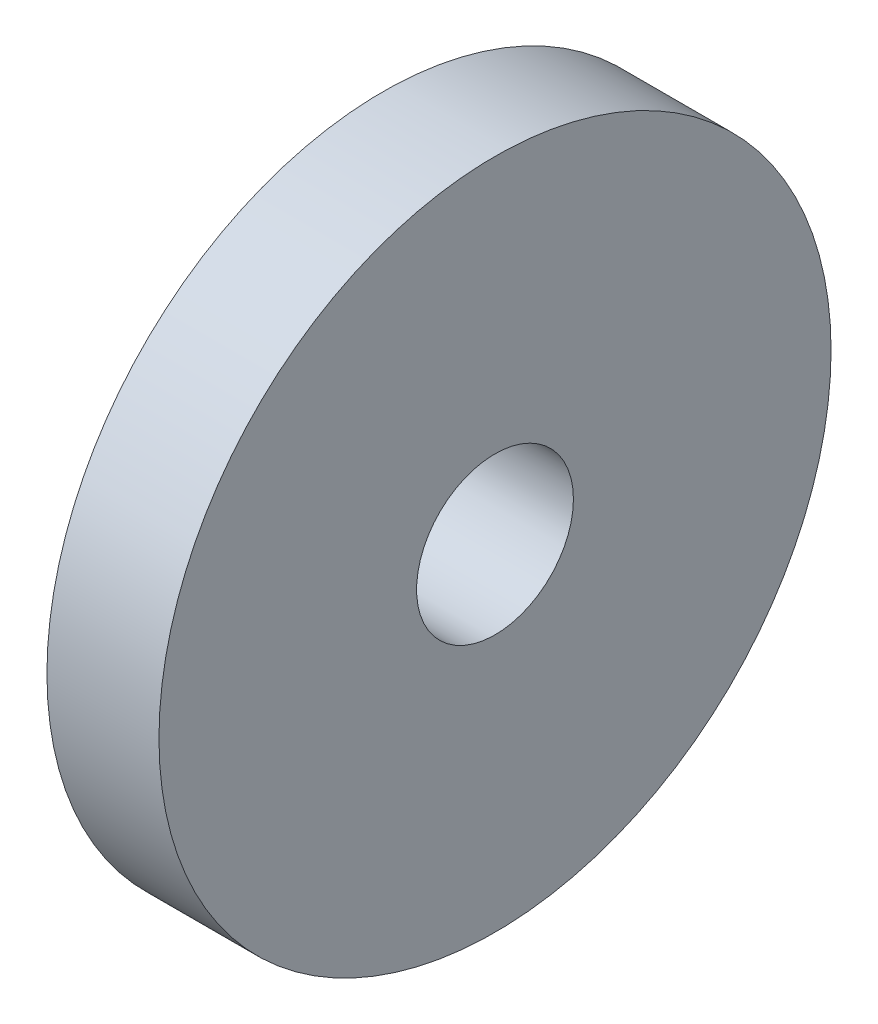
ISO-10303-21;
HEADER;
FILE_DESCRIPTION(('STEP AP214'),'2;1');
FILE_NAME('part.step','',(''),(''),'','','');
FILE_SCHEMA(('AUTOMOTIVE_DESIGN { 1 0 10303 214 1 1 1 1 }'));
ENDSEC;
DATA;
#1=APPLICATION_CONTEXT('core data for automotive mechanical design processes');
#2=APPLICATION_PROTOCOL_DEFINITION('international standard','automotive_design',2000,#1);
#3=PRODUCT_CONTEXT('',#1,'mechanical');
#4=PRODUCT('Part','Part','',(#3));
#5=PRODUCT_RELATED_PRODUCT_CATEGORY('part','',(#4));
#6=PRODUCT_DEFINITION_FORMATION('','',#4);
#7=PRODUCT_DEFINITION_CONTEXT('part definition',#1,'design');
#8=PRODUCT_DEFINITION('design','',#6,#7);
#9=PRODUCT_DEFINITION_SHAPE('','',#8);
#10=(LENGTH_UNIT() NAMED_UNIT(*) SI_UNIT(.MILLI.,.METRE.));
#11=(NAMED_UNIT(*) PLANE_ANGLE_UNIT() SI_UNIT($,.RADIAN.));
#12=(NAMED_UNIT(*) SI_UNIT($,.STERADIAN.) SOLID_ANGLE_UNIT());
#13=UNCERTAINTY_MEASURE_WITH_UNIT(LENGTH_MEASURE(1.E-05),#10,'distance_accuracy_value','');
#14=(GEOMETRIC_REPRESENTATION_CONTEXT(3) GLOBAL_UNCERTAINTY_ASSIGNED_CONTEXT((#13)) GLOBAL_UNIT_ASSIGNED_CONTEXT((#10,
#11,#12)) REPRESENTATION_CONTEXT('',''));
#15=CARTESIAN_POINT('',(0.,0.,0.));
#16=DIRECTION('',(0.,0.,1.));
#17=DIRECTION('',(1.,0.,0.));
#18=AXIS2_PLACEMENT_3D('',#15,#16,#17);
#19=CARTESIAN_POINT('',(5.,0.,0.));
#20=DIRECTION('',(1.,0.,0.));
#21=DIRECTION('',(0.,0.,-1.));
#22=AXIS2_PLACEMENT_3D('',#19,#20,#21);
#23=PLANE('',#22);
#24=CARTESIAN_POINT('',(5.,0.,0.));
#25=DIRECTION('',(1.,0.,0.));
#26=DIRECTION('',(0.,0.,-1.));
#27=AXIS2_PLACEMENT_3D('',#24,#25,#26);
#28=CIRCLE('',#27,30.);
#29=CARTESIAN_POINT('',(5.,0.,-30.));
#30=VERTEX_POINT('',#29);
#31=EDGE_CURVE('E12',#30,#30,#28,.T.);
#32=ORIENTED_EDGE('',*,*,#31,.T.);
#33=EDGE_LOOP('',(#32));
#34=FACE_BOUND('',#33,.T.);
#35=CARTESIAN_POINT('',(5.,0.,0.));
#36=DIRECTION('',(1.,0.,0.));
#37=DIRECTION('',(0.,0.,-1.));
#38=AXIS2_PLACEMENT_3D('',#35,#36,#37);
#39=CIRCLE('',#38,7.);
#40=CARTESIAN_POINT('',(5.,0.,-7.));
#41=VERTEX_POINT('',#40);
#42=EDGE_CURVE('E51',#41,#41,#39,.T.);
#43=ORIENTED_EDGE('',*,*,#42,.F.);
#44=EDGE_LOOP('',(#43));
#45=FACE_BOUND('',#44,.T.);
#46=ADVANCED_FACE('F40',(#34,#45),#23,.T.);
#47=CARTESIAN_POINT('',(-5.,0.,0.));
#48=DIRECTION('',(1.,0.,0.));
#49=DIRECTION('',(0.,0.,-1.));
#50=AXIS2_PLACEMENT_3D('',#47,#48,#49);
#51=PLANE('',#50);
#52=CARTESIAN_POINT('',(-5.,0.,0.));
#53=DIRECTION('',(1.,0.,0.));
#54=DIRECTION('',(0.,0.,-1.));
#55=AXIS2_PLACEMENT_3D('',#52,#53,#54);
#56=CIRCLE('',#55,30.);
#57=CARTESIAN_POINT('',(-5.,0.,-30.));
#58=VERTEX_POINT('',#57);
#59=EDGE_CURVE('E44',#58,#58,#56,.T.);
#60=ORIENTED_EDGE('',*,*,#59,.F.);
#61=EDGE_LOOP('',(#60));
#62=FACE_BOUND('',#61,.T.);
#63=CARTESIAN_POINT('',(-5.,0.,0.));
#64=DIRECTION('',(1.,0.,0.));
#65=DIRECTION('',(0.,0.,-1.));
#66=AXIS2_PLACEMENT_3D('',#63,#64,#65);
#67=CIRCLE('',#66,7.);
#68=CARTESIAN_POINT('',(-5.,0.,-7.));
#69=VERTEX_POINT('',#68);
#70=EDGE_CURVE('E53',#69,#69,#67,.T.);
#71=ORIENTED_EDGE('',*,*,#70,.T.);
#72=EDGE_LOOP('',(#71));
#73=FACE_BOUND('',#72,.T.);
#74=ADVANCED_FACE('F63',(#62,#73),#51,.F.);
#75=CARTESIAN_POINT('',(5.,0.,0.));
#76=DIRECTION('',(-1.,0.,0.));
#77=DIRECTION('',(0.,0.,1.));
#78=AXIS2_PLACEMENT_3D('',#75,#76,#77);
#79=CYLINDRICAL_SURFACE('',#78,30.);
#80=ORIENTED_EDGE('',*,*,#31,.F.);
#81=EDGE_LOOP('',(#80));
#82=FACE_BOUND('',#81,.T.);
#83=ORIENTED_EDGE('',*,*,#59,.T.);
#84=EDGE_LOOP('',(#83));
#85=FACE_BOUND('',#84,.T.);
#86=ADVANCED_FACE('F42',(#82,#85),#79,.T.);
#87=CARTESIAN_POINT('',(5.,0.,0.));
#88=DIRECTION('',(-1.,0.,0.));
#89=DIRECTION('',(0.,0.,1.));
#90=AXIS2_PLACEMENT_3D('',#87,#88,#89);
#91=CYLINDRICAL_SURFACE('',#90,7.);
#92=ORIENTED_EDGE('',*,*,#42,.T.);
#93=EDGE_LOOP('',(#92));
#94=FACE_BOUND('',#93,.T.);
#95=ORIENTED_EDGE('',*,*,#70,.F.);
#96=EDGE_LOOP('',(#95));
#97=FACE_BOUND('',#96,.T.);
#98=ADVANCED_FACE('F59',(#94,#97),#91,.F.);
#99=CLOSED_SHELL('',(#46,#74,#86,#98));
#100=MANIFOLD_SOLID_BREP('B2',#99);
#101=ADVANCED_BREP_SHAPE_REPRESENTATION('',(#18,#100),#14);
#102=SHAPE_DEFINITION_REPRESENTATION(#9,#101);
ENDSEC;
END-ISO-10303-21;
